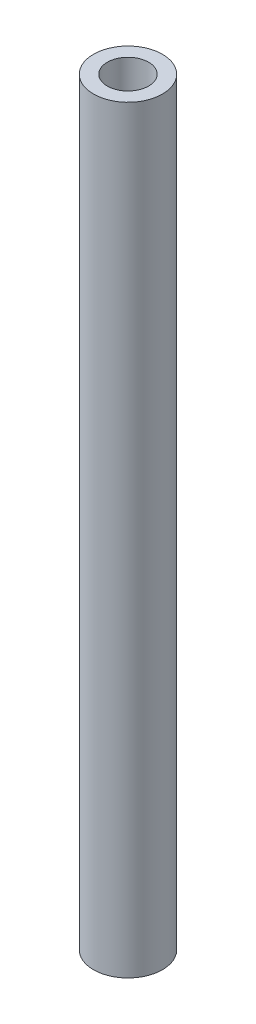
ISO-10303-21;
HEADER;
FILE_DESCRIPTION(('STEP AP214'),'2;1');
FILE_NAME('part.step','',(''),(''),'','','');
FILE_SCHEMA(('AUTOMOTIVE_DESIGN { 1 0 10303 214 1 1 1 1 }'));
ENDSEC;
DATA;
#1=APPLICATION_CONTEXT('core data for automotive mechanical design processes');
#2=APPLICATION_PROTOCOL_DEFINITION('international standard','automotive_design',2000,#1);
#3=PRODUCT_CONTEXT('',#1,'mechanical');
#4=PRODUCT('Part','Part','',(#3));
#5=PRODUCT_RELATED_PRODUCT_CATEGORY('part','',(#4));
#6=PRODUCT_DEFINITION_FORMATION('','',#4);
#7=PRODUCT_DEFINITION_CONTEXT('part definition',#1,'design');
#8=PRODUCT_DEFINITION('design','',#6,#7);
#9=PRODUCT_DEFINITION_SHAPE('','',#8);
#10=(LENGTH_UNIT() NAMED_UNIT(*) SI_UNIT(.MILLI.,.METRE.));
#11=(NAMED_UNIT(*) PLANE_ANGLE_UNIT() SI_UNIT($,.RADIAN.));
#12=(NAMED_UNIT(*) SI_UNIT($,.STERADIAN.) SOLID_ANGLE_UNIT());
#13=UNCERTAINTY_MEASURE_WITH_UNIT(LENGTH_MEASURE(1.E-05),#10,'distance_accuracy_value','');
#14=(GEOMETRIC_REPRESENTATION_CONTEXT(3) GLOBAL_UNCERTAINTY_ASSIGNED_CONTEXT((#13)) GLOBAL_UNIT_ASSIGNED_CONTEXT((#10,
#11,#12)) REPRESENTATION_CONTEXT('',''));
#15=CARTESIAN_POINT('',(0.,0.,0.));
#16=DIRECTION('',(0.,0.,1.));
#17=DIRECTION('',(1.,0.,0.));
#18=AXIS2_PLACEMENT_3D('',#15,#16,#17);
#19=CARTESIAN_POINT('',(0.,55.,0.));
#20=DIRECTION('',(0.,1.,0.));
#21=DIRECTION('',(0.,0.,1.));
#22=AXIS2_PLACEMENT_3D('',#19,#20,#21);
#23=PLANE('',#22);
#24=CARTESIAN_POINT('',(0.,55.,0.));
#25=DIRECTION('',(0.,1.,0.));
#26=DIRECTION('',(0.,0.,1.));
#27=AXIS2_PLACEMENT_3D('',#24,#25,#26);
#28=CIRCLE('',#27,2.5);
#29=CARTESIAN_POINT('',(0.,55.,2.5));
#30=VERTEX_POINT('',#29);
#31=EDGE_CURVE('E10',#30,#30,#28,.T.);
#32=ORIENTED_EDGE('',*,*,#31,.T.);
#33=EDGE_LOOP('',(#32));
#34=FACE_BOUND('',#33,.T.);
#35=CARTESIAN_POINT('',(0.,55.,0.));
#36=DIRECTION('',(0.,1.,0.));
#37=DIRECTION('',(0.,0.,1.));
#38=AXIS2_PLACEMENT_3D('',#35,#36,#37);
#39=CIRCLE('',#38,1.5);
#40=CARTESIAN_POINT('',(0.,55.,1.5));
#41=VERTEX_POINT('',#40);
#42=EDGE_CURVE('E54',#41,#41,#39,.T.);
#43=ORIENTED_EDGE('',*,*,#42,.F.);
#44=EDGE_LOOP('',(#43));
#45=FACE_BOUND('',#44,.T.);
#46=ADVANCED_FACE('F41',(#34,#45),#23,.T.);
#47=CARTESIAN_POINT('',(0.,0.,0.));
#48=DIRECTION('',(0.,1.,0.));
#49=DIRECTION('',(0.,0.,1.));
#50=AXIS2_PLACEMENT_3D('',#47,#48,#49);
#51=PLANE('',#50);
#52=CARTESIAN_POINT('',(0.,0.,0.));
#53=DIRECTION('',(0.,1.,0.));
#54=DIRECTION('',(0.,0.,1.));
#55=AXIS2_PLACEMENT_3D('',#52,#53,#54);
#56=CIRCLE('',#55,2.5);
#57=CARTESIAN_POINT('',(0.,0.,2.5));
#58=VERTEX_POINT('',#57);
#59=EDGE_CURVE('E45',#58,#58,#56,.T.);
#60=ORIENTED_EDGE('',*,*,#59,.F.);
#61=EDGE_LOOP('',(#60));
#62=FACE_BOUND('',#61,.T.);
#63=CARTESIAN_POINT('',(0.,0.,0.));
#64=DIRECTION('',(0.,1.,0.));
#65=DIRECTION('',(0.,0.,1.));
#66=AXIS2_PLACEMENT_3D('',#63,#64,#65);
#67=CIRCLE('',#66,1.5);
#68=CARTESIAN_POINT('',(0.,0.,1.5));
#69=VERTEX_POINT('',#68);
#70=EDGE_CURVE('E56',#69,#69,#67,.T.);
#71=ORIENTED_EDGE('',*,*,#70,.T.);
#72=EDGE_LOOP('',(#71));
#73=FACE_BOUND('',#72,.T.);
#74=ADVANCED_FACE('F68',(#62,#73),#51,.F.);
#75=CARTESIAN_POINT('',(0.,55.,0.));
#76=DIRECTION('',(0.,-1.,0.));
#77=DIRECTION('',(0.,0.,-1.));
#78=AXIS2_PLACEMENT_3D('',#75,#76,#77);
#79=CYLINDRICAL_SURFACE('',#78,2.5);
#80=ORIENTED_EDGE('',*,*,#31,.F.);
#81=EDGE_LOOP('',(#80));
#82=FACE_BOUND('',#81,.T.);
#83=ORIENTED_EDGE('',*,*,#59,.T.);
#84=EDGE_LOOP('',(#83));
#85=FACE_BOUND('',#84,.T.);
#86=ADVANCED_FACE('F43',(#82,#85),#79,.T.);
#87=CARTESIAN_POINT('',(0.,55.,0.));
#88=DIRECTION('',(0.,-1.,0.));
#89=DIRECTION('',(0.,0.,-1.));
#90=AXIS2_PLACEMENT_3D('',#87,#88,#89);
#91=CYLINDRICAL_SURFACE('',#90,1.5);
#92=ORIENTED_EDGE('',*,*,#42,.T.);
#93=EDGE_LOOP('',(#92));
#94=FACE_BOUND('',#93,.T.);
#95=ORIENTED_EDGE('',*,*,#70,.F.);
#96=EDGE_LOOP('',(#95));
#97=FACE_BOUND('',#96,.T.);
#98=ADVANCED_FACE('F64',(#94,#97),#91,.F.);
#99=CLOSED_SHELL('',(#46,#74,#86,#98));
#100=MANIFOLD_SOLID_BREP('B2',#99);
#101=ADVANCED_BREP_SHAPE_REPRESENTATION('',(#18,#100),#14);
#102=SHAPE_DEFINITION_REPRESENTATION(#9,#101);
ENDSEC;
END-ISO-10303-21;
